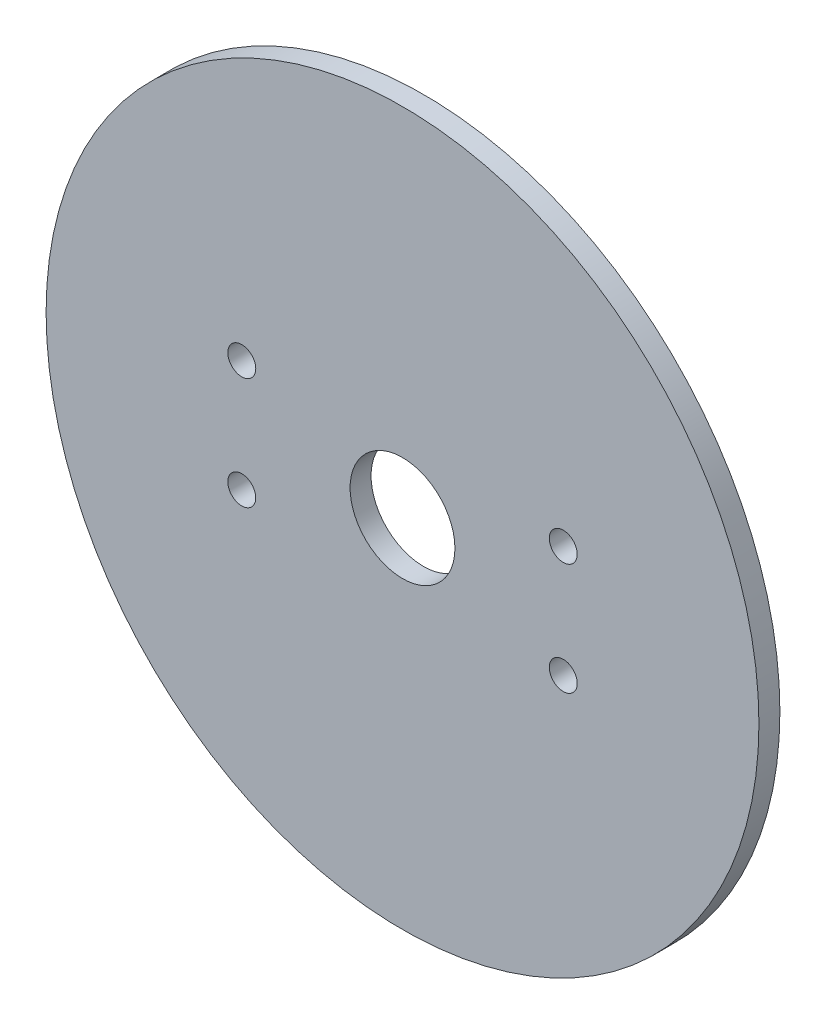
ISO-10303-21;
HEADER;
FILE_DESCRIPTION(('STEP AP214'),'2;1');
FILE_NAME('part.step','',(''),(''),'','','');
FILE_SCHEMA(('AUTOMOTIVE_DESIGN { 1 0 10303 214 1 1 1 1 }'));
ENDSEC;
DATA;
#1=APPLICATION_CONTEXT('core data for automotive mechanical design processes');
#2=APPLICATION_PROTOCOL_DEFINITION('international standard','automotive_design',2000,#1);
#3=PRODUCT_CONTEXT('',#1,'mechanical');
#4=PRODUCT('Part','Part','',(#3));
#5=PRODUCT_RELATED_PRODUCT_CATEGORY('part','',(#4));
#6=PRODUCT_DEFINITION_FORMATION('','',#4);
#7=PRODUCT_DEFINITION_CONTEXT('part definition',#1,'design');
#8=PRODUCT_DEFINITION('design','',#6,#7);
#9=PRODUCT_DEFINITION_SHAPE('','',#8);
#10=(LENGTH_UNIT() NAMED_UNIT(*) SI_UNIT(.MILLI.,.METRE.));
#11=(NAMED_UNIT(*) PLANE_ANGLE_UNIT() SI_UNIT($,.RADIAN.));
#12=(NAMED_UNIT(*) SI_UNIT($,.STERADIAN.) SOLID_ANGLE_UNIT());
#13=UNCERTAINTY_MEASURE_WITH_UNIT(LENGTH_MEASURE(1.E-05),#10,'distance_accuracy_value','');
#14=(GEOMETRIC_REPRESENTATION_CONTEXT(3) GLOBAL_UNCERTAINTY_ASSIGNED_CONTEXT((#13)) GLOBAL_UNIT_ASSIGNED_CONTEXT((#10,
#11,#12)) REPRESENTATION_CONTEXT('',''));
#15=CARTESIAN_POINT('',(0.,0.,0.));
#16=DIRECTION('',(0.,0.,1.));
#17=DIRECTION('',(1.,0.,0.));
#18=AXIS2_PLACEMENT_3D('',#15,#16,#17);
#19=CARTESIAN_POINT('',(0.,0.,3.));
#20=DIRECTION('',(0.,0.,1.));
#21=DIRECTION('',(1.,0.,0.));
#22=AXIS2_PLACEMENT_3D('',#19,#20,#21);
#23=PLANE('',#22);
#24=CARTESIAN_POINT('',(-23.,-8.,3.));
#25=DIRECTION('',(0.,0.,-1.));
#26=DIRECTION('',(-1.,0.,0.));
#27=AXIS2_PLACEMENT_3D('',#24,#25,#26);
#28=CIRCLE('',#27,2.);
#29=CARTESIAN_POINT('',(-25.,-8.,3.));
#30=VERTEX_POINT('',#29);
#31=EDGE_CURVE('E64',#30,#30,#28,.T.);
#32=ORIENTED_EDGE('',*,*,#31,.T.);
#33=EDGE_LOOP('',(#32));
#34=FACE_BOUND('',#33,.T.);
#35=CARTESIAN_POINT('',(-23.,8.,3.));
#36=DIRECTION('',(0.,0.,1.));
#37=DIRECTION('',(1.,0.,0.));
#38=AXIS2_PLACEMENT_3D('',#35,#36,#37);
#39=CIRCLE('',#38,2.);
#40=CARTESIAN_POINT('',(-21.,8.,3.));
#41=VERTEX_POINT('',#40);
#42=EDGE_CURVE('E60',#41,#41,#39,.T.);
#43=ORIENTED_EDGE('',*,*,#42,.F.);
#44=EDGE_LOOP('',(#43));
#45=FACE_BOUND('',#44,.T.);
#46=CARTESIAN_POINT('',(0.,0.,3.));
#47=DIRECTION('',(0.,0.,1.));
#48=DIRECTION('',(1.,0.,0.));
#49=AXIS2_PLACEMENT_3D('',#46,#47,#48);
#50=CIRCLE('',#49,7.5);
#51=CARTESIAN_POINT('',(7.5,0.,3.));
#52=VERTEX_POINT('',#51);
#53=EDGE_CURVE('E52',#52,#52,#50,.T.);
#54=ORIENTED_EDGE('',*,*,#53,.F.);
#55=EDGE_LOOP('',(#54));
#56=FACE_BOUND('',#55,.T.);
#57=CARTESIAN_POINT('',(0.,0.,3.));
#58=DIRECTION('',(0.,0.,1.));
#59=DIRECTION('',(1.,0.,0.));
#60=AXIS2_PLACEMENT_3D('',#57,#58,#59);
#61=CIRCLE('',#60,51.);
#62=CARTESIAN_POINT('',(51.,0.,3.));
#63=VERTEX_POINT('',#62);
#64=EDGE_CURVE('E10',#63,#63,#61,.T.);
#65=ORIENTED_EDGE('',*,*,#64,.T.);
#66=EDGE_LOOP('',(#65));
#67=FACE_BOUND('',#66,.T.);
#68=CARTESIAN_POINT('',(23.,-8.,3.));
#69=DIRECTION('',(0.,0.,1.));
#70=DIRECTION('',(1.,0.,0.));
#71=AXIS2_PLACEMENT_3D('',#68,#69,#70);
#72=CIRCLE('',#71,2.);
#73=CARTESIAN_POINT('',(25.,-8.,3.));
#74=VERTEX_POINT('',#73);
#75=EDGE_CURVE('E80',#74,#74,#72,.T.);
#76=ORIENTED_EDGE('',*,*,#75,.F.);
#77=EDGE_LOOP('',(#76));
#78=FACE_BOUND('',#77,.T.);
#79=CARTESIAN_POINT('',(23.,8.,3.));
#80=DIRECTION('',(0.,0.,-1.));
#81=DIRECTION('',(-1.,0.,0.));
#82=AXIS2_PLACEMENT_3D('',#79,#80,#81);
#83=CIRCLE('',#82,2.);
#84=CARTESIAN_POINT('',(21.,8.,3.));
#85=VERTEX_POINT('',#84);
#86=EDGE_CURVE('E72',#85,#85,#83,.T.);
#87=ORIENTED_EDGE('',*,*,#86,.T.);
#88=EDGE_LOOP('',(#87));
#89=FACE_BOUND('',#88,.T.);
#90=ADVANCED_FACE('F37',(#34,#45,#56,#67,#78,#89),#23,.T.);
#91=CARTESIAN_POINT('',(0.,0.,0.));
#92=DIRECTION('',(0.,0.,1.));
#93=DIRECTION('',(1.,0.,0.));
#94=AXIS2_PLACEMENT_3D('',#91,#92,#93);
#95=PLANE('',#94);
#96=CARTESIAN_POINT('',(23.,-8.,0.));
#97=DIRECTION('',(0.,0.,1.));
#98=DIRECTION('',(1.,0.,0.));
#99=AXIS2_PLACEMENT_3D('',#96,#97,#98);
#100=CIRCLE('',#99,2.);
#101=CARTESIAN_POINT('',(25.,-8.,0.));
#102=VERTEX_POINT('',#101);
#103=EDGE_CURVE('E76',#102,#102,#100,.T.);
#104=ORIENTED_EDGE('',*,*,#103,.T.);
#105=EDGE_LOOP('',(#104));
#106=FACE_BOUND('',#105,.T.);
#107=CARTESIAN_POINT('',(-23.,8.,0.));
#108=DIRECTION('',(0.,0.,1.));
#109=DIRECTION('',(1.,0.,0.));
#110=AXIS2_PLACEMENT_3D('',#107,#108,#109);
#111=CIRCLE('',#110,2.);
#112=CARTESIAN_POINT('',(-21.,8.,0.));
#113=VERTEX_POINT('',#112);
#114=EDGE_CURVE('E56',#113,#113,#111,.T.);
#115=ORIENTED_EDGE('',*,*,#114,.T.);
#116=EDGE_LOOP('',(#115));
#117=FACE_BOUND('',#116,.T.);
#118=CARTESIAN_POINT('',(0.,0.,0.));
#119=DIRECTION('',(0.,0.,1.));
#120=DIRECTION('',(1.,0.,0.));
#121=AXIS2_PLACEMENT_3D('',#118,#119,#120);
#122=CIRCLE('',#121,7.5);
#123=CARTESIAN_POINT('',(7.5,0.,0.));
#124=VERTEX_POINT('',#123);
#125=EDGE_CURVE('E50',#124,#124,#122,.T.);
#126=ORIENTED_EDGE('',*,*,#125,.T.);
#127=EDGE_LOOP('',(#126));
#128=FACE_BOUND('',#127,.T.);
#129=CARTESIAN_POINT('',(0.,0.,0.));
#130=DIRECTION('',(0.,0.,1.));
#131=DIRECTION('',(1.,0.,0.));
#132=AXIS2_PLACEMENT_3D('',#129,#130,#131);
#133=CIRCLE('',#132,51.);
#134=CARTESIAN_POINT('',(51.,0.,0.));
#135=VERTEX_POINT('',#134);
#136=EDGE_CURVE('E41',#135,#135,#133,.T.);
#137=ORIENTED_EDGE('',*,*,#136,.F.);
#138=EDGE_LOOP('',(#137));
#139=FACE_BOUND('',#138,.T.);
#140=CARTESIAN_POINT('',(-23.,-8.,0.));
#141=DIRECTION('',(0.,0.,-1.));
#142=DIRECTION('',(-1.,0.,0.));
#143=AXIS2_PLACEMENT_3D('',#140,#141,#142);
#144=CIRCLE('',#143,2.);
#145=CARTESIAN_POINT('',(-25.,-8.,0.));
#146=VERTEX_POINT('',#145);
#147=EDGE_CURVE('E84',#146,#146,#144,.T.);
#148=ORIENTED_EDGE('',*,*,#147,.F.);
#149=EDGE_LOOP('',(#148));
#150=FACE_BOUND('',#149,.T.);
#151=CARTESIAN_POINT('',(23.,8.,0.));
#152=DIRECTION('',(0.,0.,-1.));
#153=DIRECTION('',(-1.,0.,0.));
#154=AXIS2_PLACEMENT_3D('',#151,#152,#153);
#155=CIRCLE('',#154,2.);
#156=CARTESIAN_POINT('',(21.,8.,0.));
#157=VERTEX_POINT('',#156);
#158=EDGE_CURVE('E68',#157,#157,#155,.T.);
#159=ORIENTED_EDGE('',*,*,#158,.F.);
#160=EDGE_LOOP('',(#159));
#161=FACE_BOUND('',#160,.T.);
#162=ADVANCED_FACE('F111',(#106,#117,#128,#139,#150,#161),#95,.F.);
#163=CARTESIAN_POINT('',(0.,0.,3.));
#164=DIRECTION('',(0.,0.,-1.));
#165=DIRECTION('',(-1.,0.,0.));
#166=AXIS2_PLACEMENT_3D('',#163,#164,#165);
#167=CYLINDRICAL_SURFACE('',#166,51.);
#168=ORIENTED_EDGE('',*,*,#64,.F.);
#169=EDGE_LOOP('',(#168));
#170=FACE_BOUND('',#169,.T.);
#171=ORIENTED_EDGE('',*,*,#136,.T.);
#172=EDGE_LOOP('',(#171));
#173=FACE_BOUND('',#172,.T.);
#174=ADVANCED_FACE('F39',(#170,#173),#167,.T.);
#175=CARTESIAN_POINT('',(0.,0.,0.));
#176=DIRECTION('',(0.,0.,1.));
#177=DIRECTION('',(1.,0.,0.));
#178=AXIS2_PLACEMENT_3D('',#175,#176,#177);
#179=CYLINDRICAL_SURFACE('',#178,7.5);
#180=ORIENTED_EDGE('',*,*,#125,.F.);
#181=EDGE_LOOP('',(#180));
#182=FACE_BOUND('',#181,.T.);
#183=ORIENTED_EDGE('',*,*,#53,.T.);
#184=EDGE_LOOP('',(#183));
#185=FACE_BOUND('',#184,.T.);
#186=ADVANCED_FACE('F107',(#182,#185),#179,.F.);
#187=CARTESIAN_POINT('',(-23.,8.,0.));
#188=DIRECTION('',(0.,0.,1.));
#189=DIRECTION('',(1.,0.,0.));
#190=AXIS2_PLACEMENT_3D('',#187,#188,#189);
#191=CYLINDRICAL_SURFACE('',#190,2.);
#192=ORIENTED_EDGE('',*,*,#114,.F.);
#193=EDGE_LOOP('',(#192));
#194=FACE_BOUND('',#193,.T.);
#195=ORIENTED_EDGE('',*,*,#42,.T.);
#196=EDGE_LOOP('',(#195));
#197=FACE_BOUND('',#196,.T.);
#198=ADVANCED_FACE('F97',(#194,#197),#191,.F.);
#199=CARTESIAN_POINT('',(-23.,-8.,0.));
#200=DIRECTION('',(0.,0.,1.));
#201=DIRECTION('',(1.,0.,0.));
#202=AXIS2_PLACEMENT_3D('',#199,#200,#201);
#203=CYLINDRICAL_SURFACE('',#202,2.);
#204=ORIENTED_EDGE('',*,*,#147,.T.);
#205=EDGE_LOOP('',(#204));
#206=FACE_BOUND('',#205,.T.);
#207=ORIENTED_EDGE('',*,*,#31,.F.);
#208=EDGE_LOOP('',(#207));
#209=FACE_BOUND('',#208,.T.);
#210=ADVANCED_FACE('F94',(#206,#209),#203,.F.);
#211=CARTESIAN_POINT('',(23.,-8.,0.));
#212=DIRECTION('',(0.,0.,1.));
#213=DIRECTION('',(1.,0.,0.));
#214=AXIS2_PLACEMENT_3D('',#211,#212,#213);
#215=CYLINDRICAL_SURFACE('',#214,2.);
#216=ORIENTED_EDGE('',*,*,#103,.F.);
#217=EDGE_LOOP('',(#216));
#218=FACE_BOUND('',#217,.T.);
#219=ORIENTED_EDGE('',*,*,#75,.T.);
#220=EDGE_LOOP('',(#219));
#221=FACE_BOUND('',#220,.T.);
#222=ADVANCED_FACE('F96',(#218,#221),#215,.F.);
#223=CARTESIAN_POINT('',(23.,8.,0.));
#224=DIRECTION('',(0.,0.,1.));
#225=DIRECTION('',(1.,0.,0.));
#226=AXIS2_PLACEMENT_3D('',#223,#224,#225);
#227=CYLINDRICAL_SURFACE('',#226,2.);
#228=ORIENTED_EDGE('',*,*,#158,.T.);
#229=EDGE_LOOP('',(#228));
#230=FACE_BOUND('',#229,.T.);
#231=ORIENTED_EDGE('',*,*,#86,.F.);
#232=EDGE_LOOP('',(#231));
#233=FACE_BOUND('',#232,.T.);
#234=ADVANCED_FACE('F104',(#230,#233),#227,.F.);
#235=CLOSED_SHELL('',(#90,#162,#174,#186,#198,#210,#222,#234));
#236=MANIFOLD_SOLID_BREP('B2',#235);
#237=ADVANCED_BREP_SHAPE_REPRESENTATION('',(#18,#236),#14);
#238=SHAPE_DEFINITION_REPRESENTATION(#9,#237);
ENDSEC;
END-ISO-10303-21;
